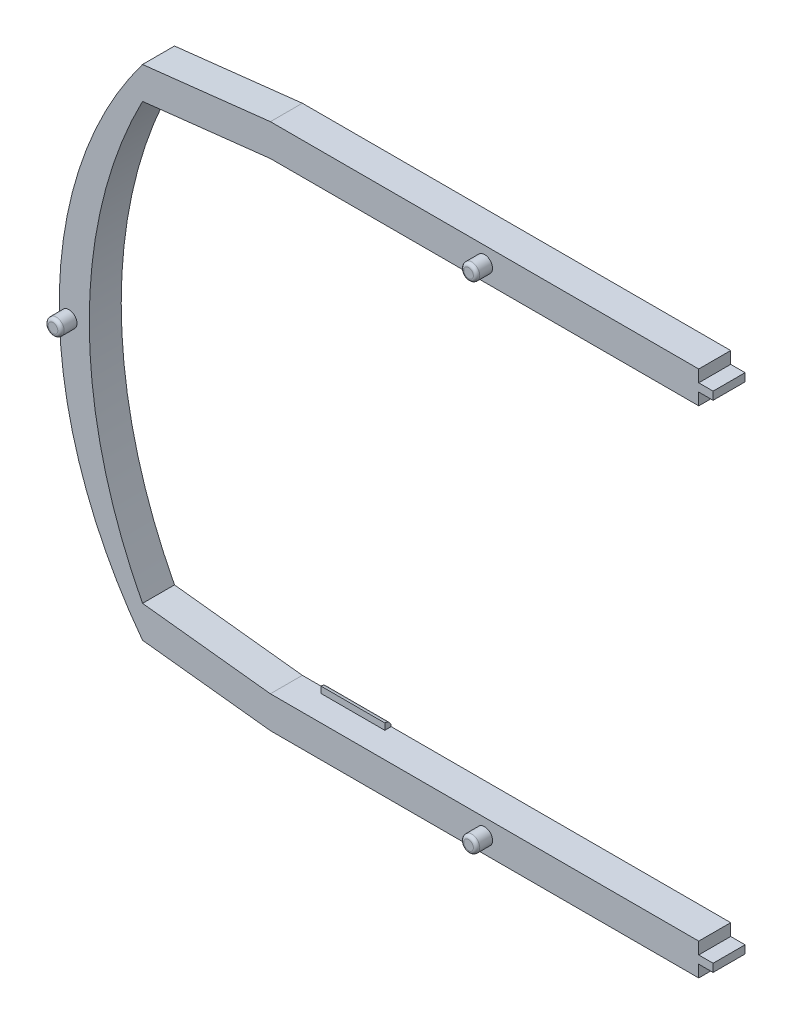
ISO-10303-21;
HEADER;
FILE_DESCRIPTION(('STEP AP214'),'2;1');
FILE_NAME('part.step','',(''),(''),'','','');
FILE_SCHEMA(('AUTOMOTIVE_DESIGN { 1 0 10303 214 1 1 1 1 }'));
ENDSEC;
DATA;
#1=APPLICATION_CONTEXT('core data for automotive mechanical design processes');
#2=APPLICATION_PROTOCOL_DEFINITION('international standard','automotive_design',2000,#1);
#3=PRODUCT_CONTEXT('',#1,'mechanical');
#4=PRODUCT('Part','Part','',(#3));
#5=PRODUCT_RELATED_PRODUCT_CATEGORY('part','',(#4));
#6=PRODUCT_DEFINITION_FORMATION('','',#4);
#7=PRODUCT_DEFINITION_CONTEXT('part definition',#1,'design');
#8=PRODUCT_DEFINITION('design','',#6,#7);
#9=PRODUCT_DEFINITION_SHAPE('','',#8);
#10=(LENGTH_UNIT() NAMED_UNIT(*) SI_UNIT(.MILLI.,.METRE.));
#11=(NAMED_UNIT(*) PLANE_ANGLE_UNIT() SI_UNIT($,.RADIAN.));
#12=(NAMED_UNIT(*) SI_UNIT($,.STERADIAN.) SOLID_ANGLE_UNIT());
#13=UNCERTAINTY_MEASURE_WITH_UNIT(LENGTH_MEASURE(1.E-05),#10,'distance_accuracy_value','');
#14=(GEOMETRIC_REPRESENTATION_CONTEXT(3) GLOBAL_UNCERTAINTY_ASSIGNED_CONTEXT((#13)) GLOBAL_UNIT_ASSIGNED_CONTEXT((#10,
#11,#12)) REPRESENTATION_CONTEXT('',''));
#15=CARTESIAN_POINT('',(0.,0.,0.));
#16=DIRECTION('',(0.,0.,1.));
#17=DIRECTION('',(1.,0.,0.));
#18=AXIS2_PLACEMENT_3D('',#15,#16,#17);
#19=CARTESIAN_POINT('',(-17.5944493399727,0.,10.));
#20=DIRECTION('',(1.,0.,0.));
#21=DIRECTION('',(0.,0.,-1.));
#22=AXIS2_PLACEMENT_3D('',#19,#20,#21);
#23=PLANE('',#22);
#24=DIRECTION('',(0.,-1.,0.));
#25=VECTOR('',#24,1.);
#26=CARTESIAN_POINT('',(-17.5944493399727,0.,10.));
#27=LINE('',#26,#25);
#28=CARTESIAN_POINT('',(-17.5944493399727,-106.439919236694,10.));
#29=VERTEX_POINT('',#28);
#30=CARTESIAN_POINT('',(-17.5944493399727,-110.189919236694,10.));
#31=VERTEX_POINT('',#30);
#32=EDGE_CURVE('E329',#29,#31,#27,.T.);
#33=ORIENTED_EDGE('',*,*,#32,.T.);
#34=DIRECTION('',(0.,0.,-1.));
#35=VECTOR('',#34,1.);
#36=CARTESIAN_POINT('',(-17.5944493399727,-110.189919236694,10.));
#37=LINE('',#36,#35);
#38=CARTESIAN_POINT('',(-17.5944493399727,-110.189919236694,0.));
#39=VERTEX_POINT('',#38);
#40=EDGE_CURVE('E241',#31,#39,#37,.T.);
#41=ORIENTED_EDGE('',*,*,#40,.T.);
#42=DIRECTION('',(0.,-1.,0.));
#43=VECTOR('',#42,1.);
#44=CARTESIAN_POINT('',(-17.5944493399727,0.,0.));
#45=LINE('',#44,#43);
#46=CARTESIAN_POINT('',(-17.5944493399727,-106.439919236694,0.));
#47=VERTEX_POINT('',#46);
#48=EDGE_CURVE('E375',#47,#39,#45,.T.);
#49=ORIENTED_EDGE('',*,*,#48,.F.);
#50=DIRECTION('',(0.,0.,-1.));
#51=VECTOR('',#50,1.);
#52=CARTESIAN_POINT('',(-17.5944493399727,-106.439919236694,10.));
#53=LINE('',#52,#51);
#54=EDGE_CURVE('E387',#29,#47,#53,.T.);
#55=ORIENTED_EDGE('',*,*,#54,.F.);
#56=EDGE_LOOP('',(#33,#41,#49,#55));
#57=FACE_BOUND('',#56,.T.);
#58=ADVANCED_FACE('F35',(#57),#23,.T.);
#59=CARTESIAN_POINT('',(-17.5944493399727,0.,10.));
#60=DIRECTION('',(-1.,0.,0.));
#61=DIRECTION('',(0.,0.,1.));
#62=AXIS2_PLACEMENT_3D('',#59,#60,#61);
#63=PLANE('',#62);
#64=DIRECTION('',(0.,0.,-1.));
#65=VECTOR('',#64,1.);
#66=CARTESIAN_POINT('',(-17.5944493399727,44.8100807633058,10.));
#67=LINE('',#66,#65);
#68=CARTESIAN_POINT('',(-17.5944493399727,44.8100807633058,10.));
#69=VERTEX_POINT('',#68);
#70=CARTESIAN_POINT('',(-17.5944493399727,44.8100807633058,0.));
#71=VERTEX_POINT('',#70);
#72=EDGE_CURVE('E264',#69,#71,#67,.T.);
#73=ORIENTED_EDGE('',*,*,#72,.T.);
#74=DIRECTION('',(0.,1.,0.));
#75=VECTOR('',#74,1.);
#76=CARTESIAN_POINT('',(-17.5944493399727,0.,0.));
#77=LINE('',#76,#75);
#78=CARTESIAN_POINT('',(-17.5944493399727,48.5600807633058,0.));
#79=VERTEX_POINT('',#78);
#80=EDGE_CURVE('E356',#71,#79,#77,.T.);
#81=ORIENTED_EDGE('',*,*,#80,.T.);
#82=DIRECTION('',(0.,0.,-1.));
#83=VECTOR('',#82,1.);
#84=CARTESIAN_POINT('',(-17.5944493399727,48.5600807633058,10.));
#85=LINE('',#84,#83);
#86=CARTESIAN_POINT('',(-17.5944493399727,48.5600807633058,10.));
#87=VERTEX_POINT('',#86);
#88=EDGE_CURVE('E401',#87,#79,#85,.T.);
#89=ORIENTED_EDGE('',*,*,#88,.F.);
#90=DIRECTION('',(0.,1.,0.));
#91=VECTOR('',#90,1.);
#92=CARTESIAN_POINT('',(-17.5944493399727,0.,10.));
#93=LINE('',#92,#91);
#94=EDGE_CURVE('E58',#69,#87,#93,.T.);
#95=ORIENTED_EDGE('',*,*,#94,.F.);
#96=EDGE_LOOP('',(#73,#81,#89,#95));
#97=FACE_BOUND('',#96,.T.);
#98=ADVANCED_FACE('F517',(#97),#63,.F.);
#99=CARTESIAN_POINT('',(0.,38.5600807633058,10.));
#100=DIRECTION('',(0.,1.,0.));
#101=DIRECTION('',(0.,0.,1.));
#102=AXIS2_PLACEMENT_3D('',#99,#100,#101);
#103=PLANE('',#102);
#104=DIRECTION('',(0.,0.,-1.));
#105=VECTOR('',#104,1.);
#106=CARTESIAN_POINT('',(-143.805852373751,38.5600807633058,2.));
#107=LINE('',#106,#105);
#108=CARTESIAN_POINT('',(-143.805852373751,38.5600807633058,2.));
#109=VERTEX_POINT('',#108);
#110=CARTESIAN_POINT('',(-143.805852373751,38.5600807633058,0.));
#111=VERTEX_POINT('',#110);
#112=EDGE_CURVE('E273',#109,#111,#107,.T.);
#113=ORIENTED_EDGE('',*,*,#112,.F.);
#114=DIRECTION('',(1.,0.,0.));
#115=VECTOR('',#114,1.);
#116=CARTESIAN_POINT('',(-143.805852373751,38.5600807633058,2.));
#117=LINE('',#116,#115);
#118=CARTESIAN_POINT('',(-123.805852373751,38.5600807633058,2.));
#119=VERTEX_POINT('',#118);
#120=EDGE_CURVE('E276',#109,#119,#117,.T.);
#121=ORIENTED_EDGE('',*,*,#120,.T.);
#122=DIRECTION('',(0.,0.,-1.));
#123=VECTOR('',#122,1.);
#124=CARTESIAN_POINT('',(-123.805852373751,38.5600807633058,2.));
#125=LINE('',#124,#123);
#126=CARTESIAN_POINT('',(-123.805852373751,38.5600807633058,0.));
#127=VERTEX_POINT('',#126);
#128=EDGE_CURVE('E270',#119,#127,#125,.T.);
#129=ORIENTED_EDGE('',*,*,#128,.T.);
#130=DIRECTION('',(1.,0.,0.));
#131=VECTOR('',#130,1.);
#132=CARTESIAN_POINT('',(0.,38.5600807633058,0.));
#133=LINE('',#132,#131);
#134=CARTESIAN_POINT('',(-17.5944493399727,38.5600807633058,0.));
#135=VERTEX_POINT('',#134);
#136=EDGE_CURVE('E352',#127,#135,#133,.T.);
#137=ORIENTED_EDGE('',*,*,#136,.T.);
#138=DIRECTION('',(0.,0.,-1.));
#139=VECTOR('',#138,1.);
#140=CARTESIAN_POINT('',(-17.5944493399727,38.5600807633058,10.));
#141=LINE('',#140,#139);
#142=CARTESIAN_POINT('',(-17.5944493399727,38.5600807633058,10.));
#143=VERTEX_POINT('',#142);
#144=EDGE_CURVE('E404',#143,#135,#141,.T.);
#145=ORIENTED_EDGE('',*,*,#144,.F.);
#146=DIRECTION('',(1.,0.,0.));
#147=VECTOR('',#146,1.);
#148=CARTESIAN_POINT('',(0.,38.5600807633058,10.));
#149=LINE('',#148,#147);
#150=CARTESIAN_POINT('',(-151.594449339973,38.5600807633058,10.));
#151=VERTEX_POINT('',#150);
#152=EDGE_CURVE('E311',#151,#143,#149,.T.);
#153=ORIENTED_EDGE('',*,*,#152,.F.);
#154=DIRECTION('',(0.,0.,-1.));
#155=VECTOR('',#154,1.);
#156=CARTESIAN_POINT('',(-151.594449339973,38.5600807633058,10.));
#157=LINE('',#156,#155);
#158=CARTESIAN_POINT('',(-151.594449339973,38.5600807633058,0.));
#159=VERTEX_POINT('',#158);
#160=EDGE_CURVE('E407',#151,#159,#157,.T.);
#161=ORIENTED_EDGE('',*,*,#160,.T.);
#162=EDGE_CURVE('E353',#159,#111,#133,.T.);
#163=ORIENTED_EDGE('',*,*,#162,.T.);
#164=EDGE_LOOP('',(#113,#121,#129,#137,#145,#153,#161,#163));
#165=FACE_BOUND('',#164,.T.);
#166=ADVANCED_FACE('F447',(#165),#103,.F.);
#167=CARTESIAN_POINT('',(0.,-106.439919236694,10.));
#168=DIRECTION('',(0.,1.,0.));
#169=DIRECTION('',(0.,0.,1.));
#170=AXIS2_PLACEMENT_3D('',#167,#168,#169);
#171=PLANE('',#170);
#172=DIRECTION('',(1.,0.,0.));
#173=VECTOR('',#172,1.);
#174=CARTESIAN_POINT('',(0.,-106.439919236694,0.));
#175=LINE('',#174,#173);
#176=CARTESIAN_POINT('',(-123.805852373751,-106.439919236694,0.));
#177=VERTEX_POINT('',#176);
#178=EDGE_CURVE('E378',#177,#47,#175,.T.);
#179=ORIENTED_EDGE('',*,*,#178,.F.);
#180=DIRECTION('',(0.,0.,-1.));
#181=VECTOR('',#180,1.);
#182=CARTESIAN_POINT('',(-123.805852373751,-106.439919236694,2.));
#183=LINE('',#182,#181);
#184=CARTESIAN_POINT('',(-123.805852373751,-106.439919236694,2.));
#185=VERTEX_POINT('',#184);
#186=EDGE_CURVE('E302',#185,#177,#183,.T.);
#187=ORIENTED_EDGE('',*,*,#186,.F.);
#188=DIRECTION('',(1.,0.,0.));
#189=VECTOR('',#188,1.);
#190=CARTESIAN_POINT('',(0.,-106.439919236694,2.));
#191=LINE('',#190,#189);
#192=CARTESIAN_POINT('',(-143.805852373751,-106.439919236694,2.));
#193=VERTEX_POINT('',#192);
#194=EDGE_CURVE('E287',#193,#185,#191,.T.);
#195=ORIENTED_EDGE('',*,*,#194,.F.);
#196=DIRECTION('',(0.,0.,-1.));
#197=VECTOR('',#196,1.);
#198=CARTESIAN_POINT('',(-143.805852373751,-106.439919236694,2.));
#199=LINE('',#198,#197);
#200=CARTESIAN_POINT('',(-143.805852373751,-106.439919236694,0.));
#201=VERTEX_POINT('',#200);
#202=EDGE_CURVE('E299',#193,#201,#199,.T.);
#203=ORIENTED_EDGE('',*,*,#202,.T.);
#204=CARTESIAN_POINT('',(-151.594449339973,-106.439919236694,0.));
#205=VERTEX_POINT('',#204);
#206=EDGE_CURVE('E379',#205,#201,#175,.T.);
#207=ORIENTED_EDGE('',*,*,#206,.F.);
#208=DIRECTION('',(0.,0.,-1.));
#209=VECTOR('',#208,1.);
#210=CARTESIAN_POINT('',(-151.594449339973,-106.439919236694,10.));
#211=LINE('',#210,#209);
#212=CARTESIAN_POINT('',(-151.594449339973,-106.439919236694,10.));
#213=VERTEX_POINT('',#212);
#214=EDGE_CURVE('E385',#213,#205,#211,.T.);
#215=ORIENTED_EDGE('',*,*,#214,.F.);
#216=DIRECTION('',(1.,0.,0.));
#217=VECTOR('',#216,1.);
#218=CARTESIAN_POINT('',(0.,-106.439919236694,10.));
#219=LINE('',#218,#217);
#220=EDGE_CURVE('E332',#213,#29,#219,.T.);
#221=ORIENTED_EDGE('',*,*,#220,.T.);
#222=ORIENTED_EDGE('',*,*,#54,.T.);
#223=EDGE_LOOP('',(#179,#187,#195,#203,#207,#215,#221,#222));
#224=FACE_BOUND('',#223,.T.);
#225=ADVANCED_FACE('F486',(#224),#171,.T.);
#226=CARTESIAN_POINT('',(-61.1863097355961,-33.9399192366942,10.));
#227=DIRECTION('',(0.,0.,-1.));
#228=DIRECTION('',(-1.,0.,0.));
#229=AXIS2_PLACEMENT_3D('',#226,#227,#228);
#230=CYLINDRICAL_SURFACE('',#229,147.072372915767);
#231=CARTESIAN_POINT('',(-61.1863097355961,-33.9399192366942,0.));
#232=DIRECTION('',(0.,0.,1.));
#233=DIRECTION('',(1.,0.,0.));
#234=AXIS2_PLACEMENT_3D('',#231,#232,#233);
#235=CIRCLE('',#234,147.072372915767);
#236=CARTESIAN_POINT('',(-191.594449339973,-101.939919236694,0.));
#237=VERTEX_POINT('',#236);
#238=CARTESIAN_POINT('',(-191.594449339973,34.0600807633058,0.));
#239=VERTEX_POINT('',#238);
#240=EDGE_CURVE('E305',#237,#239,#235,.F.);
#241=ORIENTED_EDGE('',*,*,#240,.T.);
#242=DIRECTION('',(0.,0.,-1.));
#243=VECTOR('',#242,1.);
#244=CARTESIAN_POINT('',(-191.594449339973,34.0600807633058,10.));
#245=LINE('',#244,#243);
#246=CARTESIAN_POINT('',(-191.594449339973,34.0600807633058,10.));
#247=VERTEX_POINT('',#246);
#248=EDGE_CURVE('E410',#247,#239,#245,.T.);
#249=ORIENTED_EDGE('',*,*,#248,.F.);
#250=CARTESIAN_POINT('',(-61.1863097355961,-33.9399192366942,10.));
#251=DIRECTION('',(0.,0.,1.));
#252=DIRECTION('',(1.,0.,0.));
#253=AXIS2_PLACEMENT_3D('',#250,#251,#252);
#254=CIRCLE('',#253,147.072372915767);
#255=CARTESIAN_POINT('',(-191.594449339973,-101.939919236694,10.));
#256=VERTEX_POINT('',#255);
#257=EDGE_CURVE('E306',#256,#247,#254,.F.);
#258=ORIENTED_EDGE('',*,*,#257,.F.);
#259=DIRECTION('',(0.,0.,-1.));
#260=VECTOR('',#259,1.);
#261=CARTESIAN_POINT('',(-191.594449339973,-101.939919236694,10.));
#262=LINE('',#261,#260);
#263=EDGE_CURVE('E347',#256,#237,#262,.T.);
#264=ORIENTED_EDGE('',*,*,#263,.T.);
#265=EDGE_LOOP('',(#241,#249,#258,#264));
#266=FACE_BOUND('',#265,.T.);
#267=ADVANCED_FACE('F614',(#266),#230,.F.);
#268=CARTESIAN_POINT('',(-6.17843057338652,54.9193828745468,10.));
#269=DIRECTION('',(-0.111794773067865,0.993731316158802,0.));
#270=DIRECTION('',(-0.993731316158802,-0.111794773067865,0.));
#271=AXIS2_PLACEMENT_3D('',#268,#269,#270);
#272=PLANE('',#271);
#273=DIRECTION('',(0.993731316158802,0.111794773067865,0.));
#274=VECTOR('',#273,1.);
#275=CARTESIAN_POINT('',(-6.17843057338652,54.9193828745468,0.));
#276=LINE('',#275,#274);
#277=EDGE_CURVE('E350',#239,#159,#276,.T.);
#278=ORIENTED_EDGE('',*,*,#277,.T.);
#279=ORIENTED_EDGE('',*,*,#160,.F.);
#280=DIRECTION('',(0.993731316158802,0.111794773067865,0.));
#281=VECTOR('',#280,1.);
#282=CARTESIAN_POINT('',(-6.17843057338652,54.9193828745468,10.));
#283=LINE('',#282,#281);
#284=EDGE_CURVE('E308',#247,#151,#283,.T.);
#285=ORIENTED_EDGE('',*,*,#284,.F.);
#286=ORIENTED_EDGE('',*,*,#248,.T.);
#287=EDGE_LOOP('',(#278,#279,#285,#286));
#288=FACE_BOUND('',#287,.T.);
#289=ADVANCED_FACE('F476',(#288),#272,.F.);
#290=CARTESIAN_POINT('',(-17.5944493399727,42.3100807633058,0.));
#291=VERTEX_POINT('',#290);
#292=EDGE_CURVE('E357',#135,#291,#77,.T.);
#293=ORIENTED_EDGE('',*,*,#292,.T.);
#294=DIRECTION('',(0.,0.,-1.));
#295=VECTOR('',#294,1.);
#296=CARTESIAN_POINT('',(-17.5944493399727,42.3100807633058,10.));
#297=LINE('',#296,#295);
#298=CARTESIAN_POINT('',(-17.5944493399727,42.3100807633058,10.));
#299=VERTEX_POINT('',#298);
#300=EDGE_CURVE('E254',#299,#291,#297,.T.);
#301=ORIENTED_EDGE('',*,*,#300,.F.);
#302=EDGE_CURVE('E313',#143,#299,#93,.T.);
#303=ORIENTED_EDGE('',*,*,#302,.F.);
#304=ORIENTED_EDGE('',*,*,#144,.T.);
#305=EDGE_LOOP('',(#293,#301,#303,#304));
#306=FACE_BOUND('',#305,.T.);
#307=ADVANCED_FACE('F464',(#306),#63,.F.);
#308=CARTESIAN_POINT('',(0.,48.5600807633058,10.));
#309=DIRECTION('',(0.,1.,0.));
#310=DIRECTION('',(0.,0.,1.));
#311=AXIS2_PLACEMENT_3D('',#308,#309,#310);
#312=PLANE('',#311);
#313=DIRECTION('',(1.,0.,0.));
#314=VECTOR('',#313,1.);
#315=CARTESIAN_POINT('',(0.,48.5600807633058,0.));
#316=LINE('',#315,#314);
#317=CARTESIAN_POINT('',(-151.594449339973,48.5600807633058,0.));
#318=VERTEX_POINT('',#317);
#319=EDGE_CURVE('E359',#318,#79,#316,.T.);
#320=ORIENTED_EDGE('',*,*,#319,.F.);
#321=DIRECTION('',(0.,0.,-1.));
#322=VECTOR('',#321,1.);
#323=CARTESIAN_POINT('',(-151.594449339973,48.5600807633058,10.));
#324=LINE('',#323,#322);
#325=CARTESIAN_POINT('',(-151.594449339973,48.5600807633058,10.));
#326=VERTEX_POINT('',#325);
#327=EDGE_CURVE('E399',#326,#318,#324,.T.);
#328=ORIENTED_EDGE('',*,*,#327,.F.);
#329=DIRECTION('',(1.,0.,0.));
#330=VECTOR('',#329,1.);
#331=CARTESIAN_POINT('',(0.,48.5600807633058,10.));
#332=LINE('',#331,#330);
#333=EDGE_CURVE('E316',#326,#87,#332,.T.);
#334=ORIENTED_EDGE('',*,*,#333,.T.);
#335=ORIENTED_EDGE('',*,*,#88,.T.);
#336=EDGE_LOOP('',(#320,#328,#334,#335));
#337=FACE_BOUND('',#336,.T.);
#338=ADVANCED_FACE('F552',(#337),#312,.T.);
#339=CARTESIAN_POINT('',(-7.28937024319056,64.7944021616939,10.));
#340=DIRECTION('',(0.111794773067865,-0.993731316158802,0.));
#341=DIRECTION('',(0.993731316158802,0.111794773067865,0.));
#342=AXIS2_PLACEMENT_3D('',#339,#340,#341);
#343=PLANE('',#342);
#344=DIRECTION('',(-0.993731316158802,-0.111794773067865,0.));
#345=VECTOR('',#344,1.);
#346=CARTESIAN_POINT('',(-7.28937024319056,64.7944021616939,0.));
#347=LINE('',#346,#345);
#348=CARTESIAN_POINT('',(-191.594449339973,44.0600807633058,0.));
#349=VERTEX_POINT('',#348);
#350=EDGE_CURVE('E362',#318,#349,#347,.T.);
#351=ORIENTED_EDGE('',*,*,#350,.T.);
#352=DIRECTION('',(0.,0.,-1.));
#353=VECTOR('',#352,1.);
#354=CARTESIAN_POINT('',(-191.594449339973,44.0600807633058,10.));
#355=LINE('',#354,#353);
#356=CARTESIAN_POINT('',(-191.594449339973,44.0600807633058,10.));
#357=VERTEX_POINT('',#356);
#358=EDGE_CURVE('E397',#357,#349,#355,.T.);
#359=ORIENTED_EDGE('',*,*,#358,.F.);
#360=DIRECTION('',(-0.993731316158802,-0.111794773067865,0.));
#361=VECTOR('',#360,1.);
#362=CARTESIAN_POINT('',(-7.28937024319056,64.7944021616939,10.));
#363=LINE('',#362,#361);
#364=EDGE_CURVE('E319',#326,#357,#363,.T.);
#365=ORIENTED_EDGE('',*,*,#364,.F.);
#366=ORIENTED_EDGE('',*,*,#327,.T.);
#367=EDGE_LOOP('',(#351,#359,#365,#366));
#368=FACE_BOUND('',#367,.T.);
#369=ADVANCED_FACE('F795',(#368),#343,.F.);
#370=CARTESIAN_POINT('',(-87.914808547345,-33.9399192366942,10.));
#371=DIRECTION('',(0.,0.,-1.));
#372=DIRECTION('',(-1.,0.,0.));
#373=AXIS2_PLACEMENT_3D('',#370,#371,#372);
#374=CYLINDRICAL_SURFACE('',#373,129.743855017832);
#375=CARTESIAN_POINT('',(-87.914808547345,-33.9399192366942,0.));
#376=DIRECTION('',(0.,0.,1.));
#377=DIRECTION('',(1.,0.,0.));
#378=AXIS2_PLACEMENT_3D('',#375,#376,#377);
#379=CIRCLE('',#378,129.743855017832);
#380=CARTESIAN_POINT('',(-191.594449339973,-111.939919236694,0.));
#381=VERTEX_POINT('',#380);
#382=EDGE_CURVE('E365',#381,#349,#379,.F.);
#383=ORIENTED_EDGE('',*,*,#382,.F.);
#384=DIRECTION('',(0.,0.,-1.));
#385=VECTOR('',#384,1.);
#386=CARTESIAN_POINT('',(-191.594449339973,-111.939919236694,10.));
#387=LINE('',#386,#385);
#388=CARTESIAN_POINT('',(-191.594449339973,-111.939919236694,10.));
#389=VERTEX_POINT('',#388);
#390=EDGE_CURVE('E395',#389,#381,#387,.T.);
#391=ORIENTED_EDGE('',*,*,#390,.F.);
#392=CARTESIAN_POINT('',(-87.914808547345,-33.9399192366942,10.));
#393=DIRECTION('',(0.,0.,1.));
#394=DIRECTION('',(1.,0.,0.));
#395=AXIS2_PLACEMENT_3D('',#392,#393,#394);
#396=CIRCLE('',#395,129.743855017832);
#397=EDGE_CURVE('E321',#389,#357,#396,.F.);
#398=ORIENTED_EDGE('',*,*,#397,.T.);
#399=ORIENTED_EDGE('',*,*,#358,.T.);
#400=EDGE_LOOP('',(#383,#391,#398,#399));
#401=FACE_BOUND('',#400,.T.);
#402=ADVANCED_FACE('F546',(#401),#374,.T.);
#403=CARTESIAN_POINT('',(-14.8304107771883,-131.825873575007,10.));
#404=DIRECTION('',(-0.111794773067865,-0.993731316158802,0.));
#405=DIRECTION('',(0.993731316158802,-0.111794773067865,0.));
#406=AXIS2_PLACEMENT_3D('',#403,#404,#405);
#407=PLANE('',#406);
#408=DIRECTION('',(-0.993731316158802,0.111794773067865,0.));
#409=VECTOR('',#408,1.);
#410=CARTESIAN_POINT('',(-14.8304107771883,-131.825873575007,0.));
#411=LINE('',#410,#409);
#412=CARTESIAN_POINT('',(-151.594449339973,-116.439919236694,0.));
#413=VERTEX_POINT('',#412);
#414=EDGE_CURVE('E368',#413,#381,#411,.T.);
#415=ORIENTED_EDGE('',*,*,#414,.F.);
#416=DIRECTION('',(0.,0.,-1.));
#417=VECTOR('',#416,1.);
#418=CARTESIAN_POINT('',(-151.594449339973,-116.439919236694,10.));
#419=LINE('',#418,#417);
#420=CARTESIAN_POINT('',(-151.594449339973,-116.439919236694,10.));
#421=VERTEX_POINT('',#420);
#422=EDGE_CURVE('E393',#421,#413,#419,.T.);
#423=ORIENTED_EDGE('',*,*,#422,.F.);
#424=DIRECTION('',(-0.993731316158802,0.111794773067865,0.));
#425=VECTOR('',#424,1.);
#426=CARTESIAN_POINT('',(-14.8304107771883,-131.825873575007,10.));
#427=LINE('',#426,#425);
#428=EDGE_CURVE('E324',#421,#389,#427,.T.);
#429=ORIENTED_EDGE('',*,*,#428,.T.);
#430=ORIENTED_EDGE('',*,*,#390,.T.);
#431=EDGE_LOOP('',(#415,#423,#429,#430));
#432=FACE_BOUND('',#431,.T.);
#433=ADVANCED_FACE('F534',(#432),#407,.T.);
#434=CARTESIAN_POINT('',(0.,-116.439919236694,10.));
#435=DIRECTION('',(0.,1.,0.));
#436=DIRECTION('',(0.,0.,1.));
#437=AXIS2_PLACEMENT_3D('',#434,#435,#436);
#438=PLANE('',#437);
#439=DIRECTION('',(1.,0.,0.));
#440=VECTOR('',#439,1.);
#441=CARTESIAN_POINT('',(0.,-116.439919236694,0.));
#442=LINE('',#441,#440);
#443=CARTESIAN_POINT('',(-17.5944493399727,-116.439919236694,0.));
#444=VERTEX_POINT('',#443);
#445=EDGE_CURVE('E371',#413,#444,#442,.T.);
#446=ORIENTED_EDGE('',*,*,#445,.T.);
#447=DIRECTION('',(0.,0.,-1.));
#448=VECTOR('',#447,1.);
#449=CARTESIAN_POINT('',(-17.5944493399727,-116.439919236694,10.));
#450=LINE('',#449,#448);
#451=CARTESIAN_POINT('',(-17.5944493399727,-116.439919236694,10.));
#452=VERTEX_POINT('',#451);
#453=EDGE_CURVE('E390',#452,#444,#450,.T.);
#454=ORIENTED_EDGE('',*,*,#453,.F.);
#455=DIRECTION('',(1.,0.,0.));
#456=VECTOR('',#455,1.);
#457=CARTESIAN_POINT('',(0.,-116.439919236694,10.));
#458=LINE('',#457,#456);
#459=EDGE_CURVE('E327',#421,#452,#458,.T.);
#460=ORIENTED_EDGE('',*,*,#459,.F.);
#461=ORIENTED_EDGE('',*,*,#422,.T.);
#462=EDGE_LOOP('',(#446,#454,#460,#461));
#463=FACE_BOUND('',#462,.T.);
#464=ADVANCED_FACE('F527',(#463),#438,.F.);
#465=DIRECTION('',(0.,0.,-1.));
#466=VECTOR('',#465,1.);
#467=CARTESIAN_POINT('',(-17.5944493399727,-112.689919236694,10.));
#468=LINE('',#467,#466);
#469=CARTESIAN_POINT('',(-17.5944493399727,-112.689919236694,10.));
#470=VERTEX_POINT('',#469);
#471=CARTESIAN_POINT('',(-17.5944493399727,-112.689919236694,0.));
#472=VERTEX_POINT('',#471);
#473=EDGE_CURVE('E233',#470,#472,#468,.T.);
#474=ORIENTED_EDGE('',*,*,#473,.F.);
#475=EDGE_CURVE('E226',#470,#452,#27,.T.);
#476=ORIENTED_EDGE('',*,*,#475,.T.);
#477=ORIENTED_EDGE('',*,*,#453,.T.);
#478=EDGE_CURVE('E374',#472,#444,#45,.T.);
#479=ORIENTED_EDGE('',*,*,#478,.F.);
#480=EDGE_LOOP('',(#474,#476,#477,#479));
#481=FACE_BOUND('',#480,.T.);
#482=ADVANCED_FACE('F519',(#481),#23,.T.);
#483=CARTESIAN_POINT('',(-13.7194711073843,-121.95085428786,10.));
#484=DIRECTION('',(0.111794773067865,0.993731316158802,0.));
#485=DIRECTION('',(-0.993731316158802,0.111794773067865,0.));
#486=AXIS2_PLACEMENT_3D('',#483,#484,#485);
#487=PLANE('',#486);
#488=DIRECTION('',(0.993731316158802,-0.111794773067865,0.));
#489=VECTOR('',#488,1.);
#490=CARTESIAN_POINT('',(-13.7194711073843,-121.95085428786,0.));
#491=LINE('',#490,#489);
#492=EDGE_CURVE('E309',#237,#205,#491,.T.);
#493=ORIENTED_EDGE('',*,*,#492,.F.);
#494=ORIENTED_EDGE('',*,*,#263,.F.);
#495=DIRECTION('',(0.993731316158802,-0.111794773067865,0.));
#496=VECTOR('',#495,1.);
#497=CARTESIAN_POINT('',(-13.7194711073843,-121.95085428786,10.));
#498=LINE('',#497,#496);
#499=EDGE_CURVE('E335',#256,#213,#498,.T.);
#500=ORIENTED_EDGE('',*,*,#499,.T.);
#501=ORIENTED_EDGE('',*,*,#214,.T.);
#502=EDGE_LOOP('',(#493,#494,#500,#501));
#503=FACE_BOUND('',#502,.T.);
#504=ADVANCED_FACE('F481',(#503),#487,.T.);
#505=CARTESIAN_POINT('',(0.,0.,10.));
#506=DIRECTION('',(0.,0.,1.));
#507=DIRECTION('',(1.,0.,0.));
#508=AXIS2_PLACEMENT_3D('',#505,#506,#507);
#509=PLANE('',#508);
#510=ORIENTED_EDGE('',*,*,#257,.T.);
#511=ORIENTED_EDGE('',*,*,#284,.T.);
#512=ORIENTED_EDGE('',*,*,#152,.T.);
#513=ORIENTED_EDGE('',*,*,#302,.T.);
#514=DIRECTION('',(-1.,0.,0.));
#515=VECTOR('',#514,1.);
#516=CARTESIAN_POINT('',(0.,42.3100807633058,10.));
#517=LINE('',#516,#515);
#518=CARTESIAN_POINT('',(-13.0944493399727,42.3100807633058,10.));
#519=VERTEX_POINT('',#518);
#520=EDGE_CURVE('E245',#519,#299,#517,.T.);
#521=ORIENTED_EDGE('',*,*,#520,.F.);
#522=DIRECTION('',(0.,-1.,0.));
#523=VECTOR('',#522,1.);
#524=CARTESIAN_POINT('',(-13.0944493399727,0.,10.));
#525=LINE('',#524,#523);
#526=CARTESIAN_POINT('',(-13.0944493399727,44.8100807633058,10.));
#527=VERTEX_POINT('',#526);
#528=EDGE_CURVE('E248',#527,#519,#525,.T.);
#529=ORIENTED_EDGE('',*,*,#528,.F.);
#530=DIRECTION('',(-1.,0.,0.));
#531=VECTOR('',#530,1.);
#532=CARTESIAN_POINT('',(0.,44.8100807633058,10.));
#533=LINE('',#532,#531);
#534=EDGE_CURVE('E252',#527,#69,#533,.T.);
#535=ORIENTED_EDGE('',*,*,#534,.T.);
#536=ORIENTED_EDGE('',*,*,#94,.T.);
#537=ORIENTED_EDGE('',*,*,#333,.F.);
#538=ORIENTED_EDGE('',*,*,#364,.T.);
#539=ORIENTED_EDGE('',*,*,#397,.F.);
#540=ORIENTED_EDGE('',*,*,#428,.F.);
#541=ORIENTED_EDGE('',*,*,#459,.T.);
#542=ORIENTED_EDGE('',*,*,#475,.F.);
#543=DIRECTION('',(-1.,0.,0.));
#544=VECTOR('',#543,1.);
#545=CARTESIAN_POINT('',(0.,-112.689919236694,10.));
#546=LINE('',#545,#544);
#547=CARTESIAN_POINT('',(-13.0944493399727,-112.689919236694,10.));
#548=VERTEX_POINT('',#547);
#549=EDGE_CURVE('E210',#548,#470,#546,.T.);
#550=ORIENTED_EDGE('',*,*,#549,.F.);
#551=DIRECTION('',(0.,-1.,0.));
#552=VECTOR('',#551,1.);
#553=CARTESIAN_POINT('',(-13.0944493399727,0.,10.));
#554=LINE('',#553,#552);
#555=CARTESIAN_POINT('',(-13.0944493399727,-110.189919236694,10.));
#556=VERTEX_POINT('',#555);
#557=EDGE_CURVE('E224',#556,#548,#554,.T.);
#558=ORIENTED_EDGE('',*,*,#557,.F.);
#559=DIRECTION('',(-1.,0.,0.));
#560=VECTOR('',#559,1.);
#561=CARTESIAN_POINT('',(0.,-110.189919236694,10.));
#562=LINE('',#561,#560);
#563=EDGE_CURVE('E231',#556,#31,#562,.T.);
#564=ORIENTED_EDGE('',*,*,#563,.T.);
#565=ORIENTED_EDGE('',*,*,#32,.F.);
#566=ORIENTED_EDGE('',*,*,#220,.F.);
#567=ORIENTED_EDGE('',*,*,#499,.F.);
#568=EDGE_LOOP('',(#510,#511,#512,#513,#521,#529,#535,#536,#537,#538,#539,#540,#541,#542,#550,
#558,#564,#565,#566,#567));
#569=FACE_BOUND('',#568,.T.);
#570=CARTESIAN_POINT('',(-84.5944493399727,43.5600807633058,10.));
#571=DIRECTION('',(0.,0.,1.));
#572=DIRECTION('',(1.,0.,0.));
#573=AXIS2_PLACEMENT_3D('',#570,#571,#572);
#574=CIRCLE('',#573,2.5);
#575=CARTESIAN_POINT('',(-82.0944493399727,43.5600807633058,10.));
#576=VERTEX_POINT('',#575);
#577=EDGE_CURVE('E338',#576,#576,#574,.T.);
#578=ORIENTED_EDGE('',*,*,#577,.F.);
#579=EDGE_LOOP('',(#578));
#580=FACE_BOUND('',#579,.T.);
#581=CARTESIAN_POINT('',(-214.5938612948,-36.3632373879328,10.));
#582=DIRECTION('',(0.,0.,1.));
#583=DIRECTION('',(1.,0.,0.));
#584=AXIS2_PLACEMENT_3D('',#581,#582,#583);
#585=CIRCLE('',#584,2.5);
#586=CARTESIAN_POINT('',(-212.0938612948,-36.3632373879328,10.));
#587=VERTEX_POINT('',#586);
#588=EDGE_CURVE('E341',#587,#587,#585,.T.);
#589=ORIENTED_EDGE('',*,*,#588,.F.);
#590=EDGE_LOOP('',(#589));
#591=FACE_BOUND('',#590,.T.);
#592=CARTESIAN_POINT('',(-84.5944493399727,-111.439919236694,10.));
#593=DIRECTION('',(0.,0.,1.));
#594=DIRECTION('',(1.,0.,0.));
#595=AXIS2_PLACEMENT_3D('',#592,#593,#594);
#596=CIRCLE('',#595,2.5);
#597=CARTESIAN_POINT('',(-82.0944493399727,-111.439919236694,10.));
#598=VERTEX_POINT('',#597);
#599=EDGE_CURVE('E344',#598,#598,#596,.T.);
#600=ORIENTED_EDGE('',*,*,#599,.F.);
#601=EDGE_LOOP('',(#600));
#602=FACE_BOUND('',#601,.T.);
#603=ADVANCED_FACE('F222',(#569,#580,#591,#602),#509,.T.);
#604=CARTESIAN_POINT('',(0.,0.,0.));
#605=DIRECTION('',(0.,0.,1.));
#606=DIRECTION('',(1.,0.,0.));
#607=AXIS2_PLACEMENT_3D('',#604,#605,#606);
#608=PLANE('',#607);
#609=ORIENTED_EDGE('',*,*,#136,.F.);
#610=DIRECTION('',(1.,0.,0.));
#611=VECTOR('',#610,1.);
#612=CARTESIAN_POINT('',(0.,38.5600807633058,0.));
#613=LINE('',#612,#611);
#614=EDGE_CURVE('E43',#127,#111,#613,.F.);
#615=ORIENTED_EDGE('',*,*,#614,.T.);
#616=ORIENTED_EDGE('',*,*,#162,.F.);
#617=ORIENTED_EDGE('',*,*,#277,.F.);
#618=ORIENTED_EDGE('',*,*,#240,.F.);
#619=ORIENTED_EDGE('',*,*,#492,.T.);
#620=ORIENTED_EDGE('',*,*,#206,.T.);
#621=DIRECTION('',(1.,0.,0.));
#622=VECTOR('',#621,1.);
#623=CARTESIAN_POINT('',(-123.805852373751,-106.439919236694,0.));
#624=LINE('',#623,#622);
#625=EDGE_CURVE('E431',#201,#177,#624,.T.);
#626=ORIENTED_EDGE('',*,*,#625,.T.);
#627=ORIENTED_EDGE('',*,*,#178,.T.);
#628=ORIENTED_EDGE('',*,*,#48,.T.);
#629=DIRECTION('',(-1.,0.,0.));
#630=VECTOR('',#629,1.);
#631=CARTESIAN_POINT('',(0.,-110.189919236694,0.));
#632=LINE('',#631,#630);
#633=CARTESIAN_POINT('',(-13.0944493399727,-110.189919236694,0.));
#634=VERTEX_POINT('',#633);
#635=EDGE_CURVE('E227',#634,#39,#632,.T.);
#636=ORIENTED_EDGE('',*,*,#635,.F.);
#637=DIRECTION('',(0.,-1.,0.));
#638=VECTOR('',#637,1.);
#639=CARTESIAN_POINT('',(-13.0944493399727,0.,0.));
#640=LINE('',#639,#638);
#641=CARTESIAN_POINT('',(-13.0944493399727,-112.689919236694,0.));
#642=VERTEX_POINT('',#641);
#643=EDGE_CURVE('E237',#634,#642,#640,.T.);
#644=ORIENTED_EDGE('',*,*,#643,.T.);
#645=DIRECTION('',(-1.,0.,0.));
#646=VECTOR('',#645,1.);
#647=CARTESIAN_POINT('',(0.,-112.689919236694,0.));
#648=LINE('',#647,#646);
#649=EDGE_CURVE('E50',#642,#472,#648,.T.);
#650=ORIENTED_EDGE('',*,*,#649,.T.);
#651=ORIENTED_EDGE('',*,*,#478,.T.);
#652=ORIENTED_EDGE('',*,*,#445,.F.);
#653=ORIENTED_EDGE('',*,*,#414,.T.);
#654=ORIENTED_EDGE('',*,*,#382,.T.);
#655=ORIENTED_EDGE('',*,*,#350,.F.);
#656=ORIENTED_EDGE('',*,*,#319,.T.);
#657=ORIENTED_EDGE('',*,*,#80,.F.);
#658=DIRECTION('',(-1.,0.,0.));
#659=VECTOR('',#658,1.);
#660=CARTESIAN_POINT('',(0.,44.8100807633058,0.));
#661=LINE('',#660,#659);
#662=CARTESIAN_POINT('',(-13.0944493399727,44.8100807633058,0.));
#663=VERTEX_POINT('',#662);
#664=EDGE_CURVE('E249',#663,#71,#661,.T.);
#665=ORIENTED_EDGE('',*,*,#664,.F.);
#666=DIRECTION('',(0.,-1.,0.));
#667=VECTOR('',#666,1.);
#668=CARTESIAN_POINT('',(-13.0944493399727,0.,0.));
#669=LINE('',#668,#667);
#670=CARTESIAN_POINT('',(-13.0944493399727,42.3100807633058,0.));
#671=VERTEX_POINT('',#670);
#672=EDGE_CURVE('E257',#663,#671,#669,.T.);
#673=ORIENTED_EDGE('',*,*,#672,.T.);
#674=DIRECTION('',(-1.,0.,0.));
#675=VECTOR('',#674,1.);
#676=CARTESIAN_POINT('',(0.,42.3100807633058,0.));
#677=LINE('',#676,#675);
#678=EDGE_CURVE('E215',#671,#291,#677,.T.);
#679=ORIENTED_EDGE('',*,*,#678,.T.);
#680=ORIENTED_EDGE('',*,*,#292,.F.);
#681=EDGE_LOOP('',(#609,#615,#616,#617,#618,#619,#620,#626,#627,#628,#636,#644,#650,#651,#652,
#653,#654,#655,#656,#657,#665,#673,#679,#680));
#682=FACE_BOUND('',#681,.T.);
#683=ADVANCED_FACE('F442',(#682),#608,.F.);
#684=CARTESIAN_POINT('',(-123.805852373751,0.,2.));
#685=DIRECTION('',(-1.,0.,0.));
#686=DIRECTION('',(0.,0.,1.));
#687=AXIS2_PLACEMENT_3D('',#684,#685,#686);
#688=PLANE('',#687);
#689=ORIENTED_EDGE('',*,*,#186,.T.);
#690=CARTESIAN_POINT('',(-123.805852373751,-106.439919236694,2.));
#691=DIRECTION('',(-1.,0.,0.));
#692=DIRECTION('',(0.,0.,1.));
#693=AXIS2_PLACEMENT_3D('',#690,#691,#692);
#694=CIRCLE('',#693,2.);
#695=CARTESIAN_POINT('',(-123.805852373751,-104.439919236694,2.));
#696=VERTEX_POINT('',#695);
#697=EDGE_CURVE('E434',#177,#696,#694,.F.);
#698=ORIENTED_EDGE('',*,*,#697,.T.);
#699=DIRECTION('',(0.,1.,0.));
#700=VECTOR('',#699,1.);
#701=CARTESIAN_POINT('',(-123.805852373751,0.,2.));
#702=LINE('',#701,#700);
#703=EDGE_CURVE('E290',#185,#696,#702,.T.);
#704=ORIENTED_EDGE('',*,*,#703,.F.);
#705=EDGE_LOOP('',(#689,#698,#704));
#706=FACE_BOUND('',#705,.T.);
#707=ADVANCED_FACE('F493',(#706),#688,.F.);
#708=CARTESIAN_POINT('',(-143.805852373751,0.,2.));
#709=DIRECTION('',(-1.,0.,0.));
#710=DIRECTION('',(0.,0.,1.));
#711=AXIS2_PLACEMENT_3D('',#708,#709,#710);
#712=PLANE('',#711);
#713=DIRECTION('',(0.,1.,0.));
#714=VECTOR('',#713,1.);
#715=CARTESIAN_POINT('',(-143.805852373751,0.,2.));
#716=LINE('',#715,#714);
#717=CARTESIAN_POINT('',(-143.805852373751,-104.439919236694,2.));
#718=VERTEX_POINT('',#717);
#719=EDGE_CURVE('E296',#193,#718,#716,.T.);
#720=ORIENTED_EDGE('',*,*,#719,.T.);
#721=CARTESIAN_POINT('',(-143.805852373751,-106.439919236694,2.));
#722=DIRECTION('',(-1.,0.,0.));
#723=DIRECTION('',(0.,0.,1.));
#724=AXIS2_PLACEMENT_3D('',#721,#722,#723);
#725=CIRCLE('',#724,2.);
#726=EDGE_CURVE('E436',#718,#201,#725,.T.);
#727=ORIENTED_EDGE('',*,*,#726,.T.);
#728=ORIENTED_EDGE('',*,*,#202,.F.);
#729=EDGE_LOOP('',(#720,#727,#728));
#730=FACE_BOUND('',#729,.T.);
#731=ADVANCED_FACE('F604',(#730),#712,.T.);
#732=CARTESIAN_POINT('',(0.,0.,2.));
#733=DIRECTION('',(0.,0.,1.));
#734=DIRECTION('',(1.,0.,0.));
#735=AXIS2_PLACEMENT_3D('',#732,#733,#734);
#736=PLANE('',#735);
#737=ORIENTED_EDGE('',*,*,#194,.T.);
#738=ORIENTED_EDGE('',*,*,#703,.T.);
#739=DIRECTION('',(1.,0.,0.));
#740=VECTOR('',#739,1.);
#741=CARTESIAN_POINT('',(0.,-104.439919236694,2.));
#742=LINE('',#741,#740);
#743=EDGE_CURVE('E293',#718,#696,#742,.T.);
#744=ORIENTED_EDGE('',*,*,#743,.F.);
#745=ORIENTED_EDGE('',*,*,#719,.F.);
#746=EDGE_LOOP('',(#737,#738,#744,#745));
#747=FACE_BOUND('',#746,.T.);
#748=ADVANCED_FACE('F496',(#747),#736,.T.);
#749=CARTESIAN_POINT('',(-143.805852373751,38.5600807633058,2.));
#750=DIRECTION('',(1.,0.,0.));
#751=DIRECTION('',(0.,0.,-1.));
#752=AXIS2_PLACEMENT_3D('',#749,#750,#751);
#753=PLANE('',#752);
#754=ORIENTED_EDGE('',*,*,#112,.T.);
#755=CARTESIAN_POINT('',(-143.805852373751,38.5600807633058,2.));
#756=DIRECTION('',(1.,0.,0.));
#757=DIRECTION('',(0.,0.,-1.));
#758=AXIS2_PLACEMENT_3D('',#755,#756,#757);
#759=CIRCLE('',#758,2.);
#760=CARTESIAN_POINT('',(-143.805852373751,36.5600807633058,2.));
#761=VERTEX_POINT('',#760);
#762=EDGE_CURVE('E11',#111,#761,#759,.F.);
#763=ORIENTED_EDGE('',*,*,#762,.T.);
#764=DIRECTION('',(0.,-1.,0.));
#765=VECTOR('',#764,1.);
#766=CARTESIAN_POINT('',(-143.805852373751,38.5600807633058,2.));
#767=LINE('',#766,#765);
#768=EDGE_CURVE('E284',#109,#761,#767,.T.);
#769=ORIENTED_EDGE('',*,*,#768,.F.);
#770=EDGE_LOOP('',(#754,#763,#769));
#771=FACE_BOUND('',#770,.T.);
#772=ADVANCED_FACE('F452',(#771),#753,.F.);
#773=CARTESIAN_POINT('',(-123.805852373751,38.5600807633058,2.));
#774=DIRECTION('',(1.,0.,0.));
#775=DIRECTION('',(0.,0.,-1.));
#776=AXIS2_PLACEMENT_3D('',#773,#774,#775);
#777=PLANE('',#776);
#778=DIRECTION('',(0.,-1.,0.));
#779=VECTOR('',#778,1.);
#780=CARTESIAN_POINT('',(-123.805852373751,38.5600807633058,2.));
#781=LINE('',#780,#779);
#782=CARTESIAN_POINT('',(-123.805852373751,36.5600807633058,2.));
#783=VERTEX_POINT('',#782);
#784=EDGE_CURVE('E278',#119,#783,#781,.T.);
#785=ORIENTED_EDGE('',*,*,#784,.T.);
#786=CARTESIAN_POINT('',(-123.805852373751,38.5600807633058,2.));
#787=DIRECTION('',(1.,0.,0.));
#788=DIRECTION('',(0.,0.,-1.));
#789=AXIS2_PLACEMENT_3D('',#786,#787,#788);
#790=CIRCLE('',#789,2.);
#791=EDGE_CURVE('E438',#783,#127,#790,.T.);
#792=ORIENTED_EDGE('',*,*,#791,.T.);
#793=ORIENTED_EDGE('',*,*,#128,.F.);
#794=EDGE_LOOP('',(#785,#792,#793));
#795=FACE_BOUND('',#794,.T.);
#796=ADVANCED_FACE('F460',(#795),#777,.T.);
#797=CARTESIAN_POINT('',(0.,0.,2.));
#798=DIRECTION('',(0.,0.,1.));
#799=DIRECTION('',(1.,0.,0.));
#800=AXIS2_PLACEMENT_3D('',#797,#798,#799);
#801=PLANE('',#800);
#802=ORIENTED_EDGE('',*,*,#768,.T.);
#803=DIRECTION('',(1.,0.,0.));
#804=VECTOR('',#803,1.);
#805=CARTESIAN_POINT('',(-143.805852373751,36.5600807633058,2.));
#806=LINE('',#805,#804);
#807=EDGE_CURVE('E281',#761,#783,#806,.T.);
#808=ORIENTED_EDGE('',*,*,#807,.T.);
#809=ORIENTED_EDGE('',*,*,#784,.F.);
#810=ORIENTED_EDGE('',*,*,#120,.F.);
#811=EDGE_LOOP('',(#802,#808,#809,#810));
#812=FACE_BOUND('',#811,.T.);
#813=ADVANCED_FACE('F457',(#812),#801,.T.);
#814=CARTESIAN_POINT('',(-214.5938612948,-36.3632373879328,15.));
#815=DIRECTION('',(0.,0.,-1.));
#816=DIRECTION('',(-1.,0.,0.));
#817=AXIS2_PLACEMENT_3D('',#814,#815,#816);
#818=CYLINDRICAL_SURFACE('',#817,2.5);
#819=CARTESIAN_POINT('',(-214.5938612948,-36.3632373879328,14.));
#820=DIRECTION('',(0.,0.,1.));
#821=DIRECTION('',(1.,0.,0.));
#822=AXIS2_PLACEMENT_3D('',#819,#820,#821);
#823=CIRCLE('',#822,2.5);
#824=CARTESIAN_POINT('',(-212.0938612948,-36.3632373879328,14.));
#825=VERTEX_POINT('',#824);
#826=EDGE_CURVE('E428',#825,#825,#823,.F.);
#827=ORIENTED_EDGE('',*,*,#826,.T.);
#828=EDGE_LOOP('',(#827));
#829=FACE_BOUND('',#828,.T.);
#830=ORIENTED_EDGE('',*,*,#588,.T.);
#831=EDGE_LOOP('',(#830));
#832=FACE_BOUND('',#831,.T.);
#833=ADVANCED_FACE('F591',(#829,#832),#818,.T.);
#834=CARTESIAN_POINT('',(0.,0.,15.));
#835=DIRECTION('',(0.,0.,1.));
#836=DIRECTION('',(1.,0.,0.));
#837=AXIS2_PLACEMENT_3D('',#834,#835,#836);
#838=PLANE('',#837);
#839=CARTESIAN_POINT('',(-214.5938612948,-36.3632373879328,15.));
#840=DIRECTION('',(0.,0.,1.));
#841=DIRECTION('',(1.,0.,0.));
#842=AXIS2_PLACEMENT_3D('',#839,#840,#841);
#843=CIRCLE('',#842,1.5);
#844=CARTESIAN_POINT('',(-213.0938612948,-36.3632373879328,15.));
#845=VERTEX_POINT('',#844);
#846=EDGE_CURVE('E425',#845,#845,#843,.T.);
#847=ORIENTED_EDGE('',*,*,#846,.T.);
#848=EDGE_LOOP('',(#847));
#849=FACE_BOUND('',#848,.T.);
#850=ADVANCED_FACE('F587',(#849),#838,.T.);
#851=CARTESIAN_POINT('',(-84.5944493399727,43.5600807633058,15.));
#852=DIRECTION('',(0.,0.,-1.));
#853=DIRECTION('',(-1.,0.,0.));
#854=AXIS2_PLACEMENT_3D('',#851,#852,#853);
#855=CYLINDRICAL_SURFACE('',#854,2.5);
#856=CARTESIAN_POINT('',(-84.5944493399727,43.5600807633058,14.));
#857=DIRECTION('',(0.,0.,1.));
#858=DIRECTION('',(1.,0.,0.));
#859=AXIS2_PLACEMENT_3D('',#856,#857,#858);
#860=CIRCLE('',#859,2.5);
#861=CARTESIAN_POINT('',(-82.0944493399727,43.5600807633058,14.));
#862=VERTEX_POINT('',#861);
#863=EDGE_CURVE('E416',#862,#862,#860,.F.);
#864=ORIENTED_EDGE('',*,*,#863,.T.);
#865=EDGE_LOOP('',(#864));
#866=FACE_BOUND('',#865,.T.);
#867=ORIENTED_EDGE('',*,*,#577,.T.);
#868=EDGE_LOOP('',(#867));
#869=FACE_BOUND('',#868,.T.);
#870=ADVANCED_FACE('F583',(#866,#869),#855,.T.);
#871=CARTESIAN_POINT('',(0.,0.,15.));
#872=DIRECTION('',(0.,0.,1.));
#873=DIRECTION('',(1.,0.,0.));
#874=AXIS2_PLACEMENT_3D('',#871,#872,#873);
#875=PLANE('',#874);
#876=CARTESIAN_POINT('',(-84.5944493399727,43.5600807633058,15.));
#877=DIRECTION('',(0.,0.,1.));
#878=DIRECTION('',(1.,0.,0.));
#879=AXIS2_PLACEMENT_3D('',#876,#877,#878);
#880=CIRCLE('',#879,1.5);
#881=CARTESIAN_POINT('',(-83.0944493399727,43.5600807633058,15.));
#882=VERTEX_POINT('',#881);
#883=EDGE_CURVE('E413',#882,#882,#880,.T.);
#884=ORIENTED_EDGE('',*,*,#883,.T.);
#885=EDGE_LOOP('',(#884));
#886=FACE_BOUND('',#885,.T.);
#887=ADVANCED_FACE('F579',(#886),#875,.T.);
#888=CARTESIAN_POINT('',(-84.5944493399727,-111.439919236694,15.));
#889=DIRECTION('',(0.,0.,-1.));
#890=DIRECTION('',(-1.,0.,0.));
#891=AXIS2_PLACEMENT_3D('',#888,#889,#890);
#892=CYLINDRICAL_SURFACE('',#891,2.5);
#893=CARTESIAN_POINT('',(-84.5944493399727,-111.439919236694,14.));
#894=DIRECTION('',(0.,0.,1.));
#895=DIRECTION('',(1.,0.,0.));
#896=AXIS2_PLACEMENT_3D('',#893,#894,#895);
#897=CIRCLE('',#896,2.5);
#898=CARTESIAN_POINT('',(-82.0944493399727,-111.439919236694,14.));
#899=VERTEX_POINT('',#898);
#900=EDGE_CURVE('E422',#899,#899,#897,.F.);
#901=ORIENTED_EDGE('',*,*,#900,.T.);
#902=EDGE_LOOP('',(#901));
#903=FACE_BOUND('',#902,.T.);
#904=ORIENTED_EDGE('',*,*,#599,.T.);
#905=EDGE_LOOP('',(#904));
#906=FACE_BOUND('',#905,.T.);
#907=ADVANCED_FACE('F575',(#903,#906),#892,.T.);
#908=CARTESIAN_POINT('',(0.,0.,15.));
#909=DIRECTION('',(0.,0.,1.));
#910=DIRECTION('',(1.,0.,0.));
#911=AXIS2_PLACEMENT_3D('',#908,#909,#910);
#912=PLANE('',#911);
#913=CARTESIAN_POINT('',(-84.5944493399727,-111.439919236694,15.));
#914=DIRECTION('',(0.,0.,1.));
#915=DIRECTION('',(1.,0.,0.));
#916=AXIS2_PLACEMENT_3D('',#913,#914,#915);
#917=CIRCLE('',#916,1.5);
#918=CARTESIAN_POINT('',(-83.0944493399727,-111.439919236694,15.));
#919=VERTEX_POINT('',#918);
#920=EDGE_CURVE('E419',#919,#919,#917,.T.);
#921=ORIENTED_EDGE('',*,*,#920,.T.);
#922=EDGE_LOOP('',(#921));
#923=FACE_BOUND('',#922,.T.);
#924=ADVANCED_FACE('F572',(#923),#912,.T.);
#925=CARTESIAN_POINT('',(0.,42.3100807633058,10.));
#926=DIRECTION('',(0.,-1.,0.));
#927=DIRECTION('',(0.,0.,-1.));
#928=AXIS2_PLACEMENT_3D('',#925,#926,#927);
#929=PLANE('',#928);
#930=ORIENTED_EDGE('',*,*,#678,.F.);
#931=DIRECTION('',(0.,0.,-1.));
#932=VECTOR('',#931,1.);
#933=CARTESIAN_POINT('',(-13.0944493399727,42.3100807633058,10.));
#934=LINE('',#933,#932);
#935=EDGE_CURVE('E268',#519,#671,#934,.T.);
#936=ORIENTED_EDGE('',*,*,#935,.F.);
#937=ORIENTED_EDGE('',*,*,#520,.T.);
#938=ORIENTED_EDGE('',*,*,#300,.T.);
#939=EDGE_LOOP('',(#930,#936,#937,#938));
#940=FACE_BOUND('',#939,.T.);
#941=ADVANCED_FACE('F469',(#940),#929,.T.);
#942=CARTESIAN_POINT('',(-13.0944493399727,0.,10.));
#943=DIRECTION('',(1.,0.,0.));
#944=DIRECTION('',(0.,0.,-1.));
#945=AXIS2_PLACEMENT_3D('',#942,#943,#944);
#946=PLANE('',#945);
#947=ORIENTED_EDGE('',*,*,#672,.F.);
#948=DIRECTION('',(0.,0.,-1.));
#949=VECTOR('',#948,1.);
#950=CARTESIAN_POINT('',(-13.0944493399727,44.8100807633058,10.));
#951=LINE('',#950,#949);
#952=EDGE_CURVE('E266',#527,#663,#951,.T.);
#953=ORIENTED_EDGE('',*,*,#952,.F.);
#954=ORIENTED_EDGE('',*,*,#528,.T.);
#955=ORIENTED_EDGE('',*,*,#935,.T.);
#956=EDGE_LOOP('',(#947,#953,#954,#955));
#957=FACE_BOUND('',#956,.T.);
#958=ADVANCED_FACE('F558',(#957),#946,.T.);
#959=CARTESIAN_POINT('',(0.,44.8100807633058,10.));
#960=DIRECTION('',(0.,-1.,0.));
#961=DIRECTION('',(0.,0.,-1.));
#962=AXIS2_PLACEMENT_3D('',#959,#960,#961);
#963=PLANE('',#962);
#964=ORIENTED_EDGE('',*,*,#664,.T.);
#965=ORIENTED_EDGE('',*,*,#72,.F.);
#966=ORIENTED_EDGE('',*,*,#534,.F.);
#967=ORIENTED_EDGE('',*,*,#952,.T.);
#968=EDGE_LOOP('',(#964,#965,#966,#967));
#969=FACE_BOUND('',#968,.T.);
#970=ADVANCED_FACE('F560',(#969),#963,.F.);
#971=CARTESIAN_POINT('',(0.,-112.689919236694,10.));
#972=DIRECTION('',(0.,-1.,0.));
#973=DIRECTION('',(0.,0.,-1.));
#974=AXIS2_PLACEMENT_3D('',#971,#972,#973);
#975=PLANE('',#974);
#976=ORIENTED_EDGE('',*,*,#649,.F.);
#977=DIRECTION('',(0.,0.,-1.));
#978=VECTOR('',#977,1.);
#979=CARTESIAN_POINT('',(-13.0944493399727,-112.689919236694,10.));
#980=LINE('',#979,#978);
#981=EDGE_CURVE('E207',#548,#642,#980,.T.);
#982=ORIENTED_EDGE('',*,*,#981,.F.);
#983=ORIENTED_EDGE('',*,*,#549,.T.);
#984=ORIENTED_EDGE('',*,*,#473,.T.);
#985=EDGE_LOOP('',(#976,#982,#983,#984));
#986=FACE_BOUND('',#985,.T.);
#987=ADVANCED_FACE('F209',(#986),#975,.T.);
#988=CARTESIAN_POINT('',(-13.0944493399727,0.,10.));
#989=DIRECTION('',(1.,0.,0.));
#990=DIRECTION('',(0.,0.,-1.));
#991=AXIS2_PLACEMENT_3D('',#988,#989,#990);
#992=PLANE('',#991);
#993=ORIENTED_EDGE('',*,*,#643,.F.);
#994=DIRECTION('',(0.,0.,-1.));
#995=VECTOR('',#994,1.);
#996=CARTESIAN_POINT('',(-13.0944493399727,-110.189919236694,10.));
#997=LINE('',#996,#995);
#998=EDGE_CURVE('E216',#556,#634,#997,.T.);
#999=ORIENTED_EDGE('',*,*,#998,.F.);
#1000=ORIENTED_EDGE('',*,*,#557,.T.);
#1001=ORIENTED_EDGE('',*,*,#981,.T.);
#1002=EDGE_LOOP('',(#993,#999,#1000,#1001));
#1003=FACE_BOUND('',#1002,.T.);
#1004=ADVANCED_FACE('F229',(#1003),#992,.T.);
#1005=CARTESIAN_POINT('',(0.,-110.189919236694,10.));
#1006=DIRECTION('',(0.,-1.,0.));
#1007=DIRECTION('',(0.,0.,-1.));
#1008=AXIS2_PLACEMENT_3D('',#1005,#1006,#1007);
#1009=PLANE('',#1008);
#1010=ORIENTED_EDGE('',*,*,#635,.T.);
#1011=ORIENTED_EDGE('',*,*,#40,.F.);
#1012=ORIENTED_EDGE('',*,*,#563,.F.);
#1013=ORIENTED_EDGE('',*,*,#998,.T.);
#1014=EDGE_LOOP('',(#1010,#1011,#1012,#1013));
#1015=FACE_BOUND('',#1014,.T.);
#1016=ADVANCED_FACE('F504',(#1015),#1009,.F.);
#1017=CARTESIAN_POINT('',(-84.5944493399727,43.5600807633058,14.));
#1018=DIRECTION('',(0.,0.,1.));
#1019=DIRECTION('',(1.,0.,0.));
#1020=AXIS2_PLACEMENT_3D('',#1017,#1018,#1019);
#1021=TOROIDAL_SURFACE('',#1020,1.5,1.);
#1022=ORIENTED_EDGE('',*,*,#863,.F.);
#1023=EDGE_LOOP('',(#1022));
#1024=FACE_BOUND('',#1023,.T.);
#1025=ORIENTED_EDGE('',*,*,#883,.F.);
#1026=EDGE_LOOP('',(#1025));
#1027=FACE_BOUND('',#1026,.T.);
#1028=ADVANCED_FACE('F506',(#1024,#1027),#1021,.T.);
#1029=CARTESIAN_POINT('',(-84.5944493399727,-111.439919236694,14.));
#1030=DIRECTION('',(0.,0.,1.));
#1031=DIRECTION('',(1.,0.,0.));
#1032=AXIS2_PLACEMENT_3D('',#1029,#1030,#1031);
#1033=TOROIDAL_SURFACE('',#1032,1.5,1.);
#1034=ORIENTED_EDGE('',*,*,#900,.F.);
#1035=EDGE_LOOP('',(#1034));
#1036=FACE_BOUND('',#1035,.T.);
#1037=ORIENTED_EDGE('',*,*,#920,.F.);
#1038=EDGE_LOOP('',(#1037));
#1039=FACE_BOUND('',#1038,.T.);
#1040=ADVANCED_FACE('F512',(#1036,#1039),#1033,.T.);
#1041=CARTESIAN_POINT('',(-214.5938612948,-36.3632373879328,14.));
#1042=DIRECTION('',(0.,0.,1.));
#1043=DIRECTION('',(1.,0.,0.));
#1044=AXIS2_PLACEMENT_3D('',#1041,#1042,#1043);
#1045=TOROIDAL_SURFACE('',#1044,1.5,1.);
#1046=ORIENTED_EDGE('',*,*,#826,.F.);
#1047=EDGE_LOOP('',(#1046));
#1048=FACE_BOUND('',#1047,.T.);
#1049=ORIENTED_EDGE('',*,*,#846,.F.);
#1050=EDGE_LOOP('',(#1049));
#1051=FACE_BOUND('',#1050,.T.);
#1052=ADVANCED_FACE('F631',(#1048,#1051),#1045,.T.);
#1053=CARTESIAN_POINT('',(0.,-106.439919236694,2.));
#1054=DIRECTION('',(-1.,0.,0.));
#1055=DIRECTION('',(0.,-1.,0.));
#1056=AXIS2_PLACEMENT_3D('',#1053,#1054,#1055);
#1057=CYLINDRICAL_SURFACE('',#1056,2.);
#1058=ORIENTED_EDGE('',*,*,#726,.F.);
#1059=ORIENTED_EDGE('',*,*,#743,.T.);
#1060=ORIENTED_EDGE('',*,*,#697,.F.);
#1061=ORIENTED_EDGE('',*,*,#625,.F.);
#1062=EDGE_LOOP('',(#1058,#1059,#1060,#1061));
#1063=FACE_BOUND('',#1062,.T.);
#1064=ADVANCED_FACE('F491',(#1063),#1057,.T.);
#1065=CARTESIAN_POINT('',(-143.805852373751,38.5600807633058,2.));
#1066=DIRECTION('',(1.,0.,0.));
#1067=DIRECTION('',(0.,1.,0.));
#1068=AXIS2_PLACEMENT_3D('',#1065,#1066,#1067);
#1069=CYLINDRICAL_SURFACE('',#1068,2.);
#1070=ORIENTED_EDGE('',*,*,#762,.F.);
#1071=ORIENTED_EDGE('',*,*,#614,.F.);
#1072=ORIENTED_EDGE('',*,*,#791,.F.);
#1073=ORIENTED_EDGE('',*,*,#807,.F.);
#1074=EDGE_LOOP('',(#1070,#1071,#1072,#1073));
#1075=FACE_BOUND('',#1074,.T.);
#1076=ADVANCED_FACE('F37',(#1075),#1069,.T.);
#1077=CLOSED_SHELL('',(#58,#98,#166,#225,#267,#289,#307,#338,#369,#402,#433,#464,#482,#504,#603,
#683,#707,#731,#748,#772,#796,#813,#833,#850,#870,#887,#907,#924,#941,#958,#970,#987,#1004,
#1016,#1028,#1040,#1052,#1064,#1076));
#1078=MANIFOLD_SOLID_BREP('B2',#1077);
#1079=ADVANCED_BREP_SHAPE_REPRESENTATION('',(#18,#1078),#14);
#1080=SHAPE_DEFINITION_REPRESENTATION(#9,#1079);
ENDSEC;
END-ISO-10303-21;
